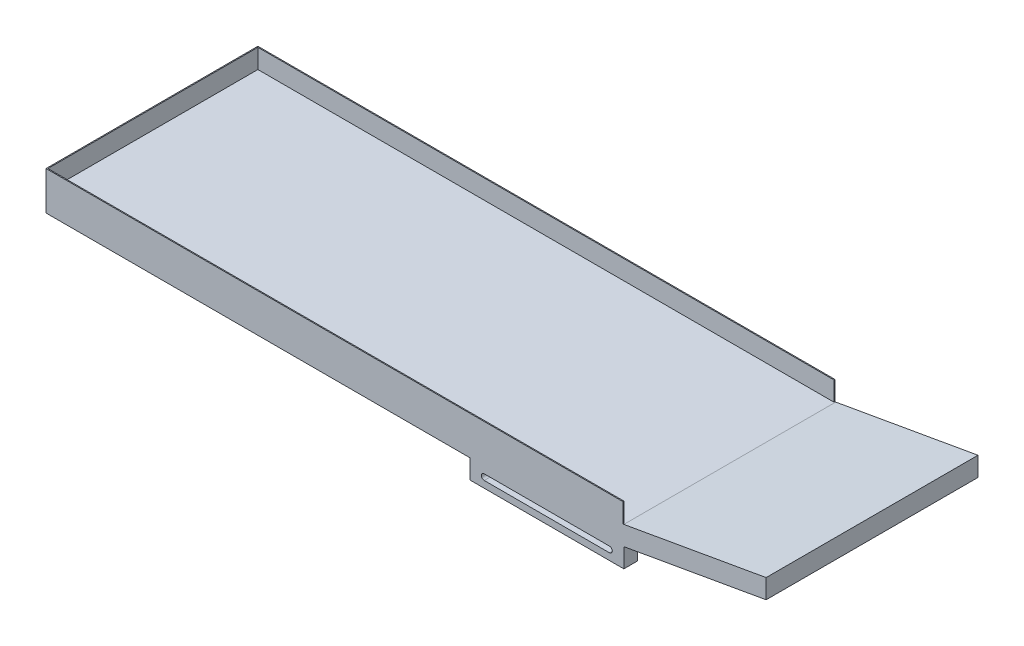
ISO-10303-21;
HEADER;
FILE_DESCRIPTION(('STEP AP214'),'2;1');
FILE_NAME('part.step','',(''),(''),'','','');
FILE_SCHEMA(('AUTOMOTIVE_DESIGN { 1 0 10303 214 1 1 1 1 }'));
ENDSEC;
DATA;
#1=APPLICATION_CONTEXT('core data for automotive mechanical design processes');
#2=APPLICATION_PROTOCOL_DEFINITION('international standard','automotive_design',2000,#1);
#3=PRODUCT_CONTEXT('',#1,'mechanical');
#4=PRODUCT('Part','Part','',(#3));
#5=PRODUCT_RELATED_PRODUCT_CATEGORY('part','',(#4));
#6=PRODUCT_DEFINITION_FORMATION('','',#4);
#7=PRODUCT_DEFINITION_CONTEXT('part definition',#1,'design');
#8=PRODUCT_DEFINITION('design','',#6,#7);
#9=PRODUCT_DEFINITION_SHAPE('','',#8);
#10=(LENGTH_UNIT() NAMED_UNIT(*) SI_UNIT(.MILLI.,.METRE.));
#11=(NAMED_UNIT(*) PLANE_ANGLE_UNIT() SI_UNIT($,.RADIAN.));
#12=(NAMED_UNIT(*) SI_UNIT($,.STERADIAN.) SOLID_ANGLE_UNIT());
#13=UNCERTAINTY_MEASURE_WITH_UNIT(LENGTH_MEASURE(1.E-05),#10,'distance_accuracy_value','');
#14=(GEOMETRIC_REPRESENTATION_CONTEXT(3) GLOBAL_UNCERTAINTY_ASSIGNED_CONTEXT((#13)) GLOBAL_UNIT_ASSIGNED_CONTEXT((#10,
#11,#12)) REPRESENTATION_CONTEXT('',''));
#15=CARTESIAN_POINT('',(0.,0.,0.));
#16=DIRECTION('',(0.,0.,1.));
#17=DIRECTION('',(1.,0.,0.));
#18=AXIS2_PLACEMENT_3D('',#15,#16,#17);
#19=CARTESIAN_POINT('',(0.,0.,220.));
#20=DIRECTION('',(0.,1.,0.));
#21=DIRECTION('',(0.,0.,1.));
#22=AXIS2_PLACEMENT_3D('',#19,#20,#21);
#23=PLANE('',#22);
#24=DIRECTION('',(-1.,0.,0.));
#25=VECTOR('',#24,1.);
#26=CARTESIAN_POINT('',(600.,0.,14.));
#27=LINE('',#26,#25);
#28=CARTESIAN_POINT('',(600.,0.,14.));
#29=VERTEX_POINT('',#28);
#30=CARTESIAN_POINT('',(440.,0.,14.));
#31=VERTEX_POINT('',#30);
#32=EDGE_CURVE('E322',#29,#31,#27,.T.);
#33=ORIENTED_EDGE('',*,*,#32,.F.);
#34=DIRECTION('',(0.,0.,-1.));
#35=VECTOR('',#34,1.);
#36=CARTESIAN_POINT('',(600.,0.,220.));
#37=LINE('',#36,#35);
#38=CARTESIAN_POINT('',(600.,0.,206.));
#39=VERTEX_POINT('',#38);
#40=EDGE_CURVE('E501',#39,#29,#37,.T.);
#41=ORIENTED_EDGE('',*,*,#40,.F.);
#42=DIRECTION('',(1.,0.,0.));
#43=VECTOR('',#42,1.);
#44=CARTESIAN_POINT('',(600.,0.,206.));
#45=LINE('',#44,#43);
#46=CARTESIAN_POINT('',(440.,0.,206.));
#47=VERTEX_POINT('',#46);
#48=EDGE_CURVE('E348',#47,#39,#45,.T.);
#49=ORIENTED_EDGE('',*,*,#48,.F.);
#50=DIRECTION('',(0.,0.,-1.));
#51=VECTOR('',#50,1.);
#52=CARTESIAN_POINT('',(440.,0.,220.));
#53=LINE('',#52,#51);
#54=CARTESIAN_POINT('',(440.,0.,220.));
#55=VERTEX_POINT('',#54);
#56=EDGE_CURVE('E331',#55,#47,#53,.T.);
#57=ORIENTED_EDGE('',*,*,#56,.F.);
#58=DIRECTION('',(1.,0.,0.));
#59=VECTOR('',#58,1.);
#60=CARTESIAN_POINT('',(0.,0.,220.));
#61=LINE('',#60,#59);
#62=CARTESIAN_POINT('',(0.,0.,220.));
#63=VERTEX_POINT('',#62);
#64=EDGE_CURVE('E454',#63,#55,#61,.T.);
#65=ORIENTED_EDGE('',*,*,#64,.F.);
#66=DIRECTION('',(0.,0.,-1.));
#67=VECTOR('',#66,1.);
#68=CARTESIAN_POINT('',(0.,0.,220.));
#69=LINE('',#68,#67);
#70=CARTESIAN_POINT('',(0.,0.,0.));
#71=VERTEX_POINT('',#70);
#72=EDGE_CURVE('E506',#63,#71,#69,.T.);
#73=ORIENTED_EDGE('',*,*,#72,.T.);
#74=DIRECTION('',(1.,0.,0.));
#75=VECTOR('',#74,1.);
#76=CARTESIAN_POINT('',(0.,0.,0.));
#77=LINE('',#76,#75);
#78=CARTESIAN_POINT('',(440.,0.,0.));
#79=VERTEX_POINT('',#78);
#80=EDGE_CURVE('E476',#71,#79,#77,.T.);
#81=ORIENTED_EDGE('',*,*,#80,.T.);
#82=DIRECTION('',(0.,0.,-1.));
#83=VECTOR('',#82,1.);
#84=CARTESIAN_POINT('',(440.,0.,0.));
#85=LINE('',#84,#83);
#86=EDGE_CURVE('E318',#31,#79,#85,.T.);
#87=ORIENTED_EDGE('',*,*,#86,.F.);
#88=EDGE_LOOP('',(#33,#41,#49,#57,#65,#73,#81,#87));
#89=FACE_BOUND('',#88,.T.);
#90=ADVANCED_FACE('F47',(#89),#23,.F.);
#91=CARTESIAN_POINT('',(0.,0.,220.));
#92=DIRECTION('',(1.,0.,0.));
#93=DIRECTION('',(0.,0.,-1.));
#94=AXIS2_PLACEMENT_3D('',#91,#92,#93);
#95=PLANE('',#94);
#96=DIRECTION('',(0.,-1.,0.));
#97=VECTOR('',#96,1.);
#98=CARTESIAN_POINT('',(0.,0.,0.));
#99=LINE('',#98,#97);
#100=CARTESIAN_POINT('',(0.,40.,0.));
#101=VERTEX_POINT('',#100);
#102=EDGE_CURVE('E449',#101,#71,#99,.T.);
#103=ORIENTED_EDGE('',*,*,#102,.T.);
#104=ORIENTED_EDGE('',*,*,#72,.F.);
#105=DIRECTION('',(0.,-1.,0.));
#106=VECTOR('',#105,1.);
#107=CARTESIAN_POINT('',(0.,0.,220.));
#108=LINE('',#107,#106);
#109=CARTESIAN_POINT('',(0.,40.,220.));
#110=VERTEX_POINT('',#109);
#111=EDGE_CURVE('E450',#110,#63,#108,.T.);
#112=ORIENTED_EDGE('',*,*,#111,.F.);
#113=DIRECTION('',(0.,0.,1.));
#114=VECTOR('',#113,1.);
#115=CARTESIAN_POINT('',(0.,40.,0.));
#116=LINE('',#115,#114);
#117=EDGE_CURVE('E404',#101,#110,#116,.T.);
#118=ORIENTED_EDGE('',*,*,#117,.F.);
#119=EDGE_LOOP('',(#103,#104,#112,#118));
#120=FACE_BOUND('',#119,.T.);
#121=ADVANCED_FACE('F49',(#120),#95,.F.);
#122=CARTESIAN_POINT('',(600.,0.,220.));
#123=DIRECTION('',(-0.173648177666931,0.984807753012208,0.));
#124=DIRECTION('',(-0.984807753012208,-0.173648177666931,0.));
#125=AXIS2_PLACEMENT_3D('',#122,#123,#124);
#126=PLANE('',#125);
#127=DIRECTION('',(0.984807753012208,0.173648177666931,0.));
#128=VECTOR('',#127,1.);
#129=CARTESIAN_POINT('',(600.,0.,0.));
#130=LINE('',#129,#128);
#131=CARTESIAN_POINT('',(600.,0.,0.));
#132=VERTEX_POINT('',#131);
#133=CARTESIAN_POINT('',(747.721162951831,26.0472266500397,0.));
#134=VERTEX_POINT('',#133);
#135=EDGE_CURVE('E479',#132,#134,#130,.T.);
#136=ORIENTED_EDGE('',*,*,#135,.T.);
#137=DIRECTION('',(0.,0.,-1.));
#138=VECTOR('',#137,1.);
#139=CARTESIAN_POINT('',(747.721162951831,26.0472266500397,220.));
#140=LINE('',#139,#138);
#141=CARTESIAN_POINT('',(747.721162951831,26.0472266500397,220.));
#142=VERTEX_POINT('',#141);
#143=EDGE_CURVE('E497',#142,#134,#140,.T.);
#144=ORIENTED_EDGE('',*,*,#143,.F.);
#145=DIRECTION('',(0.984807753012208,0.173648177666931,0.));
#146=VECTOR('',#145,1.);
#147=CARTESIAN_POINT('',(600.,0.,220.));
#148=LINE('',#147,#146);
#149=CARTESIAN_POINT('',(600.,0.,220.));
#150=VERTEX_POINT('',#149);
#151=EDGE_CURVE('E459',#150,#142,#148,.T.);
#152=ORIENTED_EDGE('',*,*,#151,.F.);
#153=EDGE_CURVE('E502',#150,#39,#37,.T.);
#154=ORIENTED_EDGE('',*,*,#153,.T.);
#155=ORIENTED_EDGE('',*,*,#40,.T.);
#156=DIRECTION('',(0.,0.,1.));
#157=VECTOR('',#156,1.);
#158=CARTESIAN_POINT('',(600.,0.,0.));
#159=LINE('',#158,#157);
#160=EDGE_CURVE('E327',#132,#29,#159,.T.);
#161=ORIENTED_EDGE('',*,*,#160,.F.);
#162=EDGE_LOOP('',(#136,#144,#152,#154,#155,#161));
#163=FACE_BOUND('',#162,.T.);
#164=ADVANCED_FACE('F545',(#163),#126,.F.);
#165=CARTESIAN_POINT('',(747.721162951831,46.0472266500397,220.));
#166=DIRECTION('',(-1.,0.,0.));
#167=DIRECTION('',(0.,0.,1.));
#168=AXIS2_PLACEMENT_3D('',#165,#166,#167);
#169=PLANE('',#168);
#170=DIRECTION('',(0.,1.,0.));
#171=VECTOR('',#170,1.);
#172=CARTESIAN_POINT('',(747.721162951831,46.0472266500397,0.));
#173=LINE('',#172,#171);
#174=CARTESIAN_POINT('',(747.721162951831,46.0472266500397,0.));
#175=VERTEX_POINT('',#174);
#176=EDGE_CURVE('E482',#134,#175,#173,.T.);
#177=ORIENTED_EDGE('',*,*,#176,.T.);
#178=DIRECTION('',(0.,0.,-1.));
#179=VECTOR('',#178,1.);
#180=CARTESIAN_POINT('',(747.721162951831,46.0472266500397,220.));
#181=LINE('',#180,#179);
#182=CARTESIAN_POINT('',(747.721162951831,46.0472266500397,220.));
#183=VERTEX_POINT('',#182);
#184=EDGE_CURVE('E493',#183,#175,#181,.T.);
#185=ORIENTED_EDGE('',*,*,#184,.F.);
#186=DIRECTION('',(0.,1.,0.));
#187=VECTOR('',#186,1.);
#188=CARTESIAN_POINT('',(747.721162951831,46.0472266500397,220.));
#189=LINE('',#188,#187);
#190=EDGE_CURVE('E462',#142,#183,#189,.T.);
#191=ORIENTED_EDGE('',*,*,#190,.F.);
#192=ORIENTED_EDGE('',*,*,#143,.T.);
#193=EDGE_LOOP('',(#177,#185,#191,#192));
#194=FACE_BOUND('',#193,.T.);
#195=ADVANCED_FACE('F549',(#194),#169,.F.);
#196=CARTESIAN_POINT('',(600.,20.,220.));
#197=DIRECTION('',(0.173648177666931,-0.984807753012208,0.));
#198=DIRECTION('',(0.984807753012208,0.173648177666931,0.));
#199=AXIS2_PLACEMENT_3D('',#196,#197,#198);
#200=PLANE('',#199);
#201=DIRECTION('',(-0.984807753012208,-0.173648177666931,0.));
#202=VECTOR('',#201,1.);
#203=CARTESIAN_POINT('',(600.,20.,0.));
#204=LINE('',#203,#202);
#205=CARTESIAN_POINT('',(600.,20.,0.));
#206=VERTEX_POINT('',#205);
#207=EDGE_CURVE('E485',#175,#206,#204,.T.);
#208=ORIENTED_EDGE('',*,*,#207,.T.);
#209=DIRECTION('',(0.,0.,-1.));
#210=VECTOR('',#209,1.);
#211=CARTESIAN_POINT('',(600.,20.,220.));
#212=LINE('',#211,#210);
#213=CARTESIAN_POINT('',(600.,20.,220.));
#214=VERTEX_POINT('',#213);
#215=EDGE_CURVE('E472',#214,#206,#212,.T.);
#216=ORIENTED_EDGE('',*,*,#215,.F.);
#217=DIRECTION('',(-0.984807753012208,-0.173648177666931,0.));
#218=VECTOR('',#217,1.);
#219=CARTESIAN_POINT('',(600.,20.,220.));
#220=LINE('',#219,#218);
#221=EDGE_CURVE('E465',#183,#214,#220,.T.);
#222=ORIENTED_EDGE('',*,*,#221,.F.);
#223=ORIENTED_EDGE('',*,*,#184,.T.);
#224=EDGE_LOOP('',(#208,#216,#222,#223));
#225=FACE_BOUND('',#224,.T.);
#226=ADVANCED_FACE('F553',(#225),#200,.F.);
#227=CARTESIAN_POINT('',(0.,20.,220.));
#228=DIRECTION('',(0.,-1.,0.));
#229=DIRECTION('',(1.,0.,0.));
#230=AXIS2_PLACEMENT_3D('',#227,#228,#229);
#231=PLANE('',#230);
#232=DIRECTION('',(1.,0.,0.));
#233=VECTOR('',#232,1.);
#234=CARTESIAN_POINT('',(0.,20.,219.));
#235=LINE('',#234,#233);
#236=CARTESIAN_POINT('',(1.00000000000003,20.,219.));
#237=VERTEX_POINT('',#236);
#238=CARTESIAN_POINT('',(599.,20.,219.));
#239=VERTEX_POINT('',#238);
#240=EDGE_CURVE('E414',#237,#239,#235,.T.);
#241=ORIENTED_EDGE('',*,*,#240,.T.);
#242=DIRECTION('',(0.,0.,1.));
#243=VECTOR('',#242,1.);
#244=CARTESIAN_POINT('',(599.,20.,0.));
#245=LINE('',#244,#243);
#246=CARTESIAN_POINT('',(599.,20.,220.));
#247=VERTEX_POINT('',#246);
#248=EDGE_CURVE('E379',#239,#247,#245,.T.);
#249=ORIENTED_EDGE('',*,*,#248,.T.);
#250=DIRECTION('',(-1.,0.,0.));
#251=VECTOR('',#250,1.);
#252=CARTESIAN_POINT('',(0.,20.,220.));
#253=LINE('',#252,#251);
#254=EDGE_CURVE('E468',#214,#247,#253,.T.);
#255=ORIENTED_EDGE('',*,*,#254,.F.);
#256=ORIENTED_EDGE('',*,*,#215,.T.);
#257=DIRECTION('',(-1.,0.,0.));
#258=VECTOR('',#257,1.);
#259=CARTESIAN_POINT('',(0.,20.,0.));
#260=LINE('',#259,#258);
#261=CARTESIAN_POINT('',(599.,20.,0.));
#262=VERTEX_POINT('',#261);
#263=EDGE_CURVE('E455',#206,#262,#260,.T.);
#264=ORIENTED_EDGE('',*,*,#263,.T.);
#265=DIRECTION('',(0.,0.,-1.));
#266=VECTOR('',#265,1.);
#267=CARTESIAN_POINT('',(599.,20.,0.));
#268=LINE('',#267,#266);
#269=CARTESIAN_POINT('',(599.,20.,1.));
#270=VERTEX_POINT('',#269);
#271=EDGE_CURVE('E385',#270,#262,#268,.T.);
#272=ORIENTED_EDGE('',*,*,#271,.F.);
#273=DIRECTION('',(-1.,0.,0.));
#274=VECTOR('',#273,1.);
#275=CARTESIAN_POINT('',(0.,20.,1.));
#276=LINE('',#275,#274);
#277=CARTESIAN_POINT('',(1.,20.,1.));
#278=VERTEX_POINT('',#277);
#279=EDGE_CURVE('E420',#270,#278,#276,.T.);
#280=ORIENTED_EDGE('',*,*,#279,.T.);
#281=DIRECTION('',(0.,0.,1.));
#282=VECTOR('',#281,1.);
#283=CARTESIAN_POINT('',(1.,20.,0.));
#284=LINE('',#283,#282);
#285=EDGE_CURVE('E417',#278,#237,#284,.T.);
#286=ORIENTED_EDGE('',*,*,#285,.T.);
#287=EDGE_LOOP('',(#241,#249,#255,#256,#264,#272,#280,#286));
#288=FACE_BOUND('',#287,.T.);
#289=ADVANCED_FACE('F557',(#288),#231,.F.);
#290=CARTESIAN_POINT('',(0.,0.,220.));
#291=DIRECTION('',(0.,0.,-1.));
#292=DIRECTION('',(-1.,0.,0.));
#293=AXIS2_PLACEMENT_3D('',#290,#291,#292);
#294=PLANE('',#293);
#295=DIRECTION('',(-1.,0.,0.));
#296=VECTOR('',#295,1.);
#297=CARTESIAN_POINT('',(585.,-7.,220.));
#298=LINE('',#297,#296);
#299=CARTESIAN_POINT('',(585.,-7.,220.));
#300=VERTEX_POINT('',#299);
#301=CARTESIAN_POINT('',(455.,-7.00000000000001,220.));
#302=VERTEX_POINT('',#301);
#303=EDGE_CURVE('E267',#300,#302,#298,.T.);
#304=ORIENTED_EDGE('',*,*,#303,.F.);
#305=CARTESIAN_POINT('',(585.,-10.,220.));
#306=DIRECTION('',(0.,0.,1.));
#307=DIRECTION('',(1.,0.,0.));
#308=AXIS2_PLACEMENT_3D('',#305,#306,#307);
#309=CIRCLE('',#308,3.);
#310=CARTESIAN_POINT('',(585.,-13.,220.));
#311=VERTEX_POINT('',#310);
#312=EDGE_CURVE('E63',#311,#300,#309,.T.);
#313=ORIENTED_EDGE('',*,*,#312,.F.);
#314=DIRECTION('',(1.,0.,0.));
#315=VECTOR('',#314,1.);
#316=CARTESIAN_POINT('',(585.,-13.,220.));
#317=LINE('',#316,#315);
#318=CARTESIAN_POINT('',(455.,-13.,220.));
#319=VERTEX_POINT('',#318);
#320=EDGE_CURVE('E254',#319,#311,#317,.T.);
#321=ORIENTED_EDGE('',*,*,#320,.F.);
#322=CARTESIAN_POINT('',(455.,-10.,220.));
#323=DIRECTION('',(0.,0.,1.));
#324=DIRECTION('',(1.,0.,0.));
#325=AXIS2_PLACEMENT_3D('',#322,#323,#324);
#326=CIRCLE('',#325,3.);
#327=EDGE_CURVE('E258',#302,#319,#326,.T.);
#328=ORIENTED_EDGE('',*,*,#327,.F.);
#329=EDGE_LOOP('',(#304,#313,#321,#328));
#330=FACE_BOUND('',#329,.T.);
#331=ORIENTED_EDGE('',*,*,#111,.T.);
#332=ORIENTED_EDGE('',*,*,#64,.T.);
#333=DIRECTION('',(0.,1.,0.));
#334=VECTOR('',#333,1.);
#335=CARTESIAN_POINT('',(440.,-20.,220.));
#336=LINE('',#335,#334);
#337=CARTESIAN_POINT('',(440.,-20.,220.));
#338=VERTEX_POINT('',#337);
#339=EDGE_CURVE('E371',#338,#55,#336,.T.);
#340=ORIENTED_EDGE('',*,*,#339,.F.);
#341=DIRECTION('',(-1.,0.,0.));
#342=VECTOR('',#341,1.);
#343=CARTESIAN_POINT('',(600.,-20.,220.));
#344=LINE('',#343,#342);
#345=CARTESIAN_POINT('',(600.,-20.,220.));
#346=VERTEX_POINT('',#345);
#347=EDGE_CURVE('E347',#346,#338,#344,.T.);
#348=ORIENTED_EDGE('',*,*,#347,.F.);
#349=DIRECTION('',(0.,1.,0.));
#350=VECTOR('',#349,1.);
#351=CARTESIAN_POINT('',(600.,-20.,220.));
#352=LINE('',#351,#350);
#353=EDGE_CURVE('E375',#346,#150,#352,.T.);
#354=ORIENTED_EDGE('',*,*,#353,.T.);
#355=ORIENTED_EDGE('',*,*,#151,.T.);
#356=ORIENTED_EDGE('',*,*,#190,.T.);
#357=ORIENTED_EDGE('',*,*,#221,.T.);
#358=ORIENTED_EDGE('',*,*,#254,.T.);
#359=DIRECTION('',(0.,-1.,0.));
#360=VECTOR('',#359,1.);
#361=CARTESIAN_POINT('',(599.,40.,220.));
#362=LINE('',#361,#360);
#363=CARTESIAN_POINT('',(599.,40.,220.));
#364=VERTEX_POINT('',#363);
#365=EDGE_CURVE('E411',#364,#247,#362,.T.);
#366=ORIENTED_EDGE('',*,*,#365,.F.);
#367=DIRECTION('',(1.,0.,0.));
#368=VECTOR('',#367,1.);
#369=CARTESIAN_POINT('',(0.,40.,220.));
#370=LINE('',#369,#368);
#371=EDGE_CURVE('E408',#110,#364,#370,.T.);
#372=ORIENTED_EDGE('',*,*,#371,.F.);
#373=EDGE_LOOP('',(#331,#332,#340,#348,#354,#355,#356,#357,#358,#366,#372));
#374=FACE_BOUND('',#373,.T.);
#375=ADVANCED_FACE('F561',(#330,#374),#294,.F.);
#376=CARTESIAN_POINT('',(0.,0.,0.));
#377=DIRECTION('',(0.,0.,-1.));
#378=DIRECTION('',(-1.,0.,0.));
#379=AXIS2_PLACEMENT_3D('',#376,#377,#378);
#380=PLANE('',#379);
#381=CARTESIAN_POINT('',(585.,-10.,0.));
#382=DIRECTION('',(0.,0.,1.));
#383=DIRECTION('',(1.,0.,0.));
#384=AXIS2_PLACEMENT_3D('',#381,#382,#383);
#385=CIRCLE('',#384,3.);
#386=CARTESIAN_POINT('',(585.,-13.,0.));
#387=VERTEX_POINT('',#386);
#388=CARTESIAN_POINT('',(585.,-7.,0.));
#389=VERTEX_POINT('',#388);
#390=EDGE_CURVE('E234',#387,#389,#385,.T.);
#391=ORIENTED_EDGE('',*,*,#390,.T.);
#392=DIRECTION('',(-1.,0.,0.));
#393=VECTOR('',#392,1.);
#394=CARTESIAN_POINT('',(585.,-7.,0.));
#395=LINE('',#394,#393);
#396=CARTESIAN_POINT('',(455.,-7.00000000000001,0.));
#397=VERTEX_POINT('',#396);
#398=EDGE_CURVE('E243',#389,#397,#395,.T.);
#399=ORIENTED_EDGE('',*,*,#398,.T.);
#400=CARTESIAN_POINT('',(455.,-10.,0.));
#401=DIRECTION('',(0.,0.,1.));
#402=DIRECTION('',(1.,0.,0.));
#403=AXIS2_PLACEMENT_3D('',#400,#401,#402);
#404=CIRCLE('',#403,3.);
#405=CARTESIAN_POINT('',(455.,-13.,0.));
#406=VERTEX_POINT('',#405);
#407=EDGE_CURVE('E71',#397,#406,#404,.T.);
#408=ORIENTED_EDGE('',*,*,#407,.T.);
#409=DIRECTION('',(1.,0.,0.));
#410=VECTOR('',#409,1.);
#411=CARTESIAN_POINT('',(585.,-13.,0.));
#412=LINE('',#411,#410);
#413=EDGE_CURVE('E252',#406,#387,#412,.T.);
#414=ORIENTED_EDGE('',*,*,#413,.T.);
#415=EDGE_LOOP('',(#391,#399,#408,#414));
#416=FACE_BOUND('',#415,.T.);
#417=ORIENTED_EDGE('',*,*,#102,.F.);
#418=DIRECTION('',(-1.,0.,0.));
#419=VECTOR('',#418,1.);
#420=CARTESIAN_POINT('',(0.,40.,0.));
#421=LINE('',#420,#419);
#422=CARTESIAN_POINT('',(599.,40.,0.));
#423=VERTEX_POINT('',#422);
#424=EDGE_CURVE('E400',#423,#101,#421,.T.);
#425=ORIENTED_EDGE('',*,*,#424,.F.);
#426=DIRECTION('',(0.,-1.,0.));
#427=VECTOR('',#426,1.);
#428=CARTESIAN_POINT('',(599.,40.,0.));
#429=LINE('',#428,#427);
#430=EDGE_CURVE('E429',#423,#262,#429,.T.);
#431=ORIENTED_EDGE('',*,*,#430,.T.);
#432=ORIENTED_EDGE('',*,*,#263,.F.);
#433=ORIENTED_EDGE('',*,*,#207,.F.);
#434=ORIENTED_EDGE('',*,*,#176,.F.);
#435=ORIENTED_EDGE('',*,*,#135,.F.);
#436=DIRECTION('',(0.,1.,0.));
#437=VECTOR('',#436,1.);
#438=CARTESIAN_POINT('',(600.,-20.,0.));
#439=LINE('',#438,#437);
#440=CARTESIAN_POINT('',(600.,-20.,0.));
#441=VERTEX_POINT('',#440);
#442=EDGE_CURVE('E313',#441,#132,#439,.T.);
#443=ORIENTED_EDGE('',*,*,#442,.F.);
#444=DIRECTION('',(1.,0.,0.));
#445=VECTOR('',#444,1.);
#446=CARTESIAN_POINT('',(600.,-20.,0.));
#447=LINE('',#446,#445);
#448=CARTESIAN_POINT('',(440.,-20.,0.));
#449=VERTEX_POINT('',#448);
#450=EDGE_CURVE('E317',#449,#441,#447,.T.);
#451=ORIENTED_EDGE('',*,*,#450,.F.);
#452=DIRECTION('',(0.,1.,0.));
#453=VECTOR('',#452,1.);
#454=CARTESIAN_POINT('',(440.,-20.,0.));
#455=LINE('',#454,#453);
#456=EDGE_CURVE('E309',#449,#79,#455,.T.);
#457=ORIENTED_EDGE('',*,*,#456,.T.);
#458=ORIENTED_EDGE('',*,*,#80,.F.);
#459=EDGE_LOOP('',(#417,#425,#431,#432,#433,#434,#435,#443,#451,#457,#458));
#460=FACE_BOUND('',#459,.T.);
#461=ADVANCED_FACE('F249',(#416,#460),#380,.T.);
#462=CARTESIAN_POINT('',(599.,40.,0.));
#463=DIRECTION('',(1.,0.,0.));
#464=DIRECTION('',(0.,1.,0.));
#465=AXIS2_PLACEMENT_3D('',#462,#463,#464);
#466=PLANE('',#465);
#467=ORIENTED_EDGE('',*,*,#248,.F.);
#468=DIRECTION('',(0.,-1.,0.));
#469=VECTOR('',#468,1.);
#470=CARTESIAN_POINT('',(599.,40.,219.));
#471=LINE('',#470,#469);
#472=CARTESIAN_POINT('',(599.,40.,219.));
#473=VERTEX_POINT('',#472);
#474=EDGE_CURVE('E445',#473,#239,#471,.T.);
#475=ORIENTED_EDGE('',*,*,#474,.F.);
#476=DIRECTION('',(0.,0.,1.));
#477=VECTOR('',#476,1.);
#478=CARTESIAN_POINT('',(599.,40.,0.));
#479=LINE('',#478,#477);
#480=EDGE_CURVE('E380',#473,#364,#479,.T.);
#481=ORIENTED_EDGE('',*,*,#480,.T.);
#482=ORIENTED_EDGE('',*,*,#365,.T.);
#483=EDGE_LOOP('',(#467,#475,#481,#482));
#484=FACE_BOUND('',#483,.T.);
#485=ADVANCED_FACE('F565',(#484),#466,.T.);
#486=CARTESIAN_POINT('',(0.,40.,219.));
#487=DIRECTION('',(0.,0.,-1.));
#488=DIRECTION('',(-1.,0.,0.));
#489=AXIS2_PLACEMENT_3D('',#486,#487,#488);
#490=PLANE('',#489);
#491=ORIENTED_EDGE('',*,*,#240,.F.);
#492=DIRECTION('',(0.,-1.,0.));
#493=VECTOR('',#492,1.);
#494=CARTESIAN_POINT('',(1.00000000000003,40.,219.));
#495=LINE('',#494,#493);
#496=CARTESIAN_POINT('',(1.00000000000003,40.,219.));
#497=VERTEX_POINT('',#496);
#498=EDGE_CURVE('E441',#497,#237,#495,.T.);
#499=ORIENTED_EDGE('',*,*,#498,.F.);
#500=DIRECTION('',(1.,0.,0.));
#501=VECTOR('',#500,1.);
#502=CARTESIAN_POINT('',(0.,40.,219.));
#503=LINE('',#502,#501);
#504=EDGE_CURVE('E384',#497,#473,#503,.T.);
#505=ORIENTED_EDGE('',*,*,#504,.T.);
#506=ORIENTED_EDGE('',*,*,#474,.T.);
#507=EDGE_LOOP('',(#491,#499,#505,#506));
#508=FACE_BOUND('',#507,.T.);
#509=ADVANCED_FACE('F571',(#508),#490,.T.);
#510=CARTESIAN_POINT('',(1.,40.,0.));
#511=DIRECTION('',(1.,0.,0.));
#512=DIRECTION('',(0.,0.,-1.));
#513=AXIS2_PLACEMENT_3D('',#510,#511,#512);
#514=PLANE('',#513);
#515=ORIENTED_EDGE('',*,*,#285,.F.);
#516=DIRECTION('',(0.,-1.,0.));
#517=VECTOR('',#516,1.);
#518=CARTESIAN_POINT('',(1.,40.,1.));
#519=LINE('',#518,#517);
#520=CARTESIAN_POINT('',(1.,40.,1.));
#521=VERTEX_POINT('',#520);
#522=EDGE_CURVE('E437',#521,#278,#519,.T.);
#523=ORIENTED_EDGE('',*,*,#522,.F.);
#524=DIRECTION('',(0.,0.,1.));
#525=VECTOR('',#524,1.);
#526=CARTESIAN_POINT('',(1.,40.,0.));
#527=LINE('',#526,#525);
#528=EDGE_CURVE('E389',#521,#497,#527,.T.);
#529=ORIENTED_EDGE('',*,*,#528,.T.);
#530=ORIENTED_EDGE('',*,*,#498,.T.);
#531=EDGE_LOOP('',(#515,#523,#529,#530));
#532=FACE_BOUND('',#531,.T.);
#533=ADVANCED_FACE('F575',(#532),#514,.T.);
#534=CARTESIAN_POINT('',(0.,40.,1.));
#535=DIRECTION('',(0.,0.,1.));
#536=DIRECTION('',(1.,0.,0.));
#537=AXIS2_PLACEMENT_3D('',#534,#535,#536);
#538=PLANE('',#537);
#539=ORIENTED_EDGE('',*,*,#279,.F.);
#540=DIRECTION('',(0.,-1.,0.));
#541=VECTOR('',#540,1.);
#542=CARTESIAN_POINT('',(599.,40.,1.));
#543=LINE('',#542,#541);
#544=CARTESIAN_POINT('',(599.,40.,1.));
#545=VERTEX_POINT('',#544);
#546=EDGE_CURVE('E433',#545,#270,#543,.T.);
#547=ORIENTED_EDGE('',*,*,#546,.F.);
#548=DIRECTION('',(-1.,0.,0.));
#549=VECTOR('',#548,1.);
#550=CARTESIAN_POINT('',(0.,40.,1.));
#551=LINE('',#550,#549);
#552=EDGE_CURVE('E393',#545,#521,#551,.T.);
#553=ORIENTED_EDGE('',*,*,#552,.T.);
#554=ORIENTED_EDGE('',*,*,#522,.T.);
#555=EDGE_LOOP('',(#539,#547,#553,#554));
#556=FACE_BOUND('',#555,.T.);
#557=ADVANCED_FACE('F579',(#556),#538,.T.);
#558=CARTESIAN_POINT('',(599.,40.,0.));
#559=DIRECTION('',(-1.,0.,0.));
#560=DIRECTION('',(0.,-1.,0.));
#561=AXIS2_PLACEMENT_3D('',#558,#559,#560);
#562=PLANE('',#561);
#563=ORIENTED_EDGE('',*,*,#271,.T.);
#564=ORIENTED_EDGE('',*,*,#430,.F.);
#565=DIRECTION('',(0.,0.,-1.));
#566=VECTOR('',#565,1.);
#567=CARTESIAN_POINT('',(599.,40.,0.));
#568=LINE('',#567,#566);
#569=EDGE_CURVE('E397',#545,#423,#568,.T.);
#570=ORIENTED_EDGE('',*,*,#569,.F.);
#571=ORIENTED_EDGE('',*,*,#546,.T.);
#572=EDGE_LOOP('',(#563,#564,#570,#571));
#573=FACE_BOUND('',#572,.T.);
#574=ADVANCED_FACE('F583',(#573),#562,.F.);
#575=CARTESIAN_POINT('',(0.,40.,0.));
#576=DIRECTION('',(0.,1.,0.));
#577=DIRECTION('',(-1.,0.,0.));
#578=AXIS2_PLACEMENT_3D('',#575,#576,#577);
#579=PLANE('',#578);
#580=ORIENTED_EDGE('',*,*,#480,.F.);
#581=ORIENTED_EDGE('',*,*,#504,.F.);
#582=ORIENTED_EDGE('',*,*,#528,.F.);
#583=ORIENTED_EDGE('',*,*,#552,.F.);
#584=ORIENTED_EDGE('',*,*,#569,.T.);
#585=ORIENTED_EDGE('',*,*,#424,.T.);
#586=ORIENTED_EDGE('',*,*,#117,.T.);
#587=ORIENTED_EDGE('',*,*,#371,.T.);
#588=EDGE_LOOP('',(#580,#581,#582,#583,#584,#585,#586,#587));
#589=FACE_BOUND('',#588,.T.);
#590=ADVANCED_FACE('F587',(#589),#579,.T.);
#591=CARTESIAN_POINT('',(600.,-20.,220.));
#592=DIRECTION('',(-1.,0.,0.));
#593=DIRECTION('',(0.,0.,1.));
#594=AXIS2_PLACEMENT_3D('',#591,#592,#593);
#595=PLANE('',#594);
#596=ORIENTED_EDGE('',*,*,#153,.F.);
#597=ORIENTED_EDGE('',*,*,#353,.F.);
#598=DIRECTION('',(0.,0.,1.));
#599=VECTOR('',#598,1.);
#600=CARTESIAN_POINT('',(600.,-20.,220.));
#601=LINE('',#600,#599);
#602=CARTESIAN_POINT('',(600.,-20.,206.));
#603=VERTEX_POINT('',#602);
#604=EDGE_CURVE('E343',#603,#346,#601,.T.);
#605=ORIENTED_EDGE('',*,*,#604,.F.);
#606=DIRECTION('',(0.,1.,0.));
#607=VECTOR('',#606,1.);
#608=CARTESIAN_POINT('',(600.,-20.,206.));
#609=LINE('',#608,#607);
#610=EDGE_CURVE('E357',#603,#39,#609,.T.);
#611=ORIENTED_EDGE('',*,*,#610,.T.);
#612=EDGE_LOOP('',(#596,#597,#605,#611));
#613=FACE_BOUND('',#612,.T.);
#614=ADVANCED_FACE('F590',(#613),#595,.F.);
#615=CARTESIAN_POINT('',(440.,-20.,220.));
#616=DIRECTION('',(1.,0.,0.));
#617=DIRECTION('',(0.,0.,-1.));
#618=AXIS2_PLACEMENT_3D('',#615,#616,#617);
#619=PLANE('',#618);
#620=ORIENTED_EDGE('',*,*,#56,.T.);
#621=DIRECTION('',(0.,1.,0.));
#622=VECTOR('',#621,1.);
#623=CARTESIAN_POINT('',(440.,-20.,206.));
#624=LINE('',#623,#622);
#625=CARTESIAN_POINT('',(440.,-20.,206.));
#626=VERTEX_POINT('',#625);
#627=EDGE_CURVE('E367',#626,#47,#624,.T.);
#628=ORIENTED_EDGE('',*,*,#627,.F.);
#629=DIRECTION('',(0.,0.,-1.));
#630=VECTOR('',#629,1.);
#631=CARTESIAN_POINT('',(440.,-20.,220.));
#632=LINE('',#631,#630);
#633=EDGE_CURVE('E351',#338,#626,#632,.T.);
#634=ORIENTED_EDGE('',*,*,#633,.F.);
#635=ORIENTED_EDGE('',*,*,#339,.T.);
#636=EDGE_LOOP('',(#620,#628,#634,#635));
#637=FACE_BOUND('',#636,.T.);
#638=ADVANCED_FACE('F594',(#637),#619,.F.);
#639=CARTESIAN_POINT('',(600.,-20.,206.));
#640=DIRECTION('',(0.,0.,1.));
#641=DIRECTION('',(1.,0.,0.));
#642=AXIS2_PLACEMENT_3D('',#639,#640,#641);
#643=PLANE('',#642);
#644=DIRECTION('',(1.,0.,0.));
#645=VECTOR('',#644,1.);
#646=CARTESIAN_POINT('',(600.,-13.,206.));
#647=LINE('',#646,#645);
#648=CARTESIAN_POINT('',(455.,-13.,206.));
#649=VERTEX_POINT('',#648);
#650=CARTESIAN_POINT('',(585.,-13.,206.));
#651=VERTEX_POINT('',#650);
#652=EDGE_CURVE('E293',#649,#651,#647,.T.);
#653=ORIENTED_EDGE('',*,*,#652,.T.);
#654=CARTESIAN_POINT('',(585.,-10.,206.));
#655=DIRECTION('',(0.,0.,1.));
#656=DIRECTION('',(1.,0.,0.));
#657=AXIS2_PLACEMENT_3D('',#654,#655,#656);
#658=CIRCLE('',#657,3.);
#659=CARTESIAN_POINT('',(585.,-7.,206.));
#660=VERTEX_POINT('',#659);
#661=EDGE_CURVE('E297',#651,#660,#658,.T.);
#662=ORIENTED_EDGE('',*,*,#661,.T.);
#663=DIRECTION('',(-1.,0.,0.));
#664=VECTOR('',#663,1.);
#665=CARTESIAN_POINT('',(600.,-7.,206.));
#666=LINE('',#665,#664);
#667=CARTESIAN_POINT('',(455.,-7.00000000000001,206.));
#668=VERTEX_POINT('',#667);
#669=EDGE_CURVE('E277',#660,#668,#666,.T.);
#670=ORIENTED_EDGE('',*,*,#669,.T.);
#671=CARTESIAN_POINT('',(455.,-10.,206.));
#672=DIRECTION('',(0.,0.,1.));
#673=DIRECTION('',(1.,0.,0.));
#674=AXIS2_PLACEMENT_3D('',#671,#672,#673);
#675=CIRCLE('',#674,3.);
#676=EDGE_CURVE('E289',#668,#649,#675,.T.);
#677=ORIENTED_EDGE('',*,*,#676,.T.);
#678=EDGE_LOOP('',(#653,#662,#670,#677));
#679=FACE_BOUND('',#678,.T.);
#680=ORIENTED_EDGE('',*,*,#48,.T.);
#681=ORIENTED_EDGE('',*,*,#610,.F.);
#682=DIRECTION('',(1.,0.,0.));
#683=VECTOR('',#682,1.);
#684=CARTESIAN_POINT('',(600.,-20.,206.));
#685=LINE('',#684,#683);
#686=EDGE_CURVE('E354',#626,#603,#685,.T.);
#687=ORIENTED_EDGE('',*,*,#686,.F.);
#688=ORIENTED_EDGE('',*,*,#627,.T.);
#689=EDGE_LOOP('',(#680,#681,#687,#688));
#690=FACE_BOUND('',#689,.T.);
#691=ADVANCED_FACE('F598',(#679,#690),#643,.F.);
#692=CARTESIAN_POINT('',(0.,-20.,0.));
#693=DIRECTION('',(0.,1.,0.));
#694=DIRECTION('',(0.,0.,1.));
#695=AXIS2_PLACEMENT_3D('',#692,#693,#694);
#696=PLANE('',#695);
#697=ORIENTED_EDGE('',*,*,#604,.T.);
#698=ORIENTED_EDGE('',*,*,#347,.T.);
#699=ORIENTED_EDGE('',*,*,#633,.T.);
#700=ORIENTED_EDGE('',*,*,#686,.T.);
#701=EDGE_LOOP('',(#697,#698,#699,#700));
#702=FACE_BOUND('',#701,.T.);
#703=ADVANCED_FACE('F602',(#702),#696,.F.);
#704=CARTESIAN_POINT('',(600.,-20.,0.));
#705=DIRECTION('',(-1.,0.,0.));
#706=DIRECTION('',(0.,0.,1.));
#707=AXIS2_PLACEMENT_3D('',#704,#705,#706);
#708=PLANE('',#707);
#709=ORIENTED_EDGE('',*,*,#160,.T.);
#710=DIRECTION('',(0.,1.,0.));
#711=VECTOR('',#710,1.);
#712=CARTESIAN_POINT('',(600.,-20.,14.));
#713=LINE('',#712,#711);
#714=CARTESIAN_POINT('',(600.,-20.,14.));
#715=VERTEX_POINT('',#714);
#716=EDGE_CURVE('E301',#715,#29,#713,.T.);
#717=ORIENTED_EDGE('',*,*,#716,.F.);
#718=DIRECTION('',(0.,0.,1.));
#719=VECTOR('',#718,1.);
#720=CARTESIAN_POINT('',(600.,-20.,0.));
#721=LINE('',#720,#719);
#722=EDGE_CURVE('E323',#441,#715,#721,.T.);
#723=ORIENTED_EDGE('',*,*,#722,.F.);
#724=ORIENTED_EDGE('',*,*,#442,.T.);
#725=EDGE_LOOP('',(#709,#717,#723,#724));
#726=FACE_BOUND('',#725,.T.);
#727=ADVANCED_FACE('F606',(#726),#708,.F.);
#728=CARTESIAN_POINT('',(600.,-20.,14.));
#729=DIRECTION('',(0.,0.,-1.));
#730=DIRECTION('',(-1.,0.,0.));
#731=AXIS2_PLACEMENT_3D('',#728,#729,#730);
#732=PLANE('',#731);
#733=DIRECTION('',(1.,0.,0.));
#734=VECTOR('',#733,1.);
#735=CARTESIAN_POINT('',(600.,-7.,14.));
#736=LINE('',#735,#734);
#737=CARTESIAN_POINT('',(455.,-7.00000000000001,14.));
#738=VERTEX_POINT('',#737);
#739=CARTESIAN_POINT('',(585.,-7.,14.));
#740=VERTEX_POINT('',#739);
#741=EDGE_CURVE('E510',#738,#740,#736,.T.);
#742=ORIENTED_EDGE('',*,*,#741,.T.);
#743=CARTESIAN_POINT('',(585.,-10.,14.));
#744=DIRECTION('',(0.,0.,-1.));
#745=DIRECTION('',(-1.,0.,0.));
#746=AXIS2_PLACEMENT_3D('',#743,#744,#745);
#747=CIRCLE('',#746,3.);
#748=CARTESIAN_POINT('',(585.,-13.,14.));
#749=VERTEX_POINT('',#748);
#750=EDGE_CURVE('E11',#740,#749,#747,.T.);
#751=ORIENTED_EDGE('',*,*,#750,.T.);
#752=DIRECTION('',(-1.,0.,0.));
#753=VECTOR('',#752,1.);
#754=CARTESIAN_POINT('',(600.,-13.,14.));
#755=LINE('',#754,#753);
#756=CARTESIAN_POINT('',(455.,-13.,14.));
#757=VERTEX_POINT('',#756);
#758=EDGE_CURVE('E56',#749,#757,#755,.T.);
#759=ORIENTED_EDGE('',*,*,#758,.T.);
#760=CARTESIAN_POINT('',(455.,-10.,14.));
#761=DIRECTION('',(0.,0.,-1.));
#762=DIRECTION('',(-1.,0.,0.));
#763=AXIS2_PLACEMENT_3D('',#760,#761,#762);
#764=CIRCLE('',#763,3.);
#765=EDGE_CURVE('E513',#757,#738,#764,.T.);
#766=ORIENTED_EDGE('',*,*,#765,.T.);
#767=EDGE_LOOP('',(#742,#751,#759,#766));
#768=FACE_BOUND('',#767,.T.);
#769=ORIENTED_EDGE('',*,*,#32,.T.);
#770=DIRECTION('',(0.,1.,0.));
#771=VECTOR('',#770,1.);
#772=CARTESIAN_POINT('',(440.,-20.,14.));
#773=LINE('',#772,#771);
#774=CARTESIAN_POINT('',(440.,-20.,14.));
#775=VERTEX_POINT('',#774);
#776=EDGE_CURVE('E305',#775,#31,#773,.T.);
#777=ORIENTED_EDGE('',*,*,#776,.F.);
#778=DIRECTION('',(-1.,0.,0.));
#779=VECTOR('',#778,1.);
#780=CARTESIAN_POINT('',(600.,-20.,14.));
#781=LINE('',#780,#779);
#782=EDGE_CURVE('E337',#715,#775,#781,.T.);
#783=ORIENTED_EDGE('',*,*,#782,.F.);
#784=ORIENTED_EDGE('',*,*,#716,.T.);
#785=EDGE_LOOP('',(#769,#777,#783,#784));
#786=FACE_BOUND('',#785,.T.);
#787=ADVANCED_FACE('F519',(#768,#786),#732,.F.);
#788=CARTESIAN_POINT('',(440.,-20.,0.));
#789=DIRECTION('',(1.,0.,0.));
#790=DIRECTION('',(0.,0.,-1.));
#791=AXIS2_PLACEMENT_3D('',#788,#789,#790);
#792=PLANE('',#791);
#793=ORIENTED_EDGE('',*,*,#86,.T.);
#794=ORIENTED_EDGE('',*,*,#456,.F.);
#795=DIRECTION('',(0.,0.,-1.));
#796=VECTOR('',#795,1.);
#797=CARTESIAN_POINT('',(440.,-20.,0.));
#798=LINE('',#797,#796);
#799=EDGE_CURVE('E334',#775,#449,#798,.T.);
#800=ORIENTED_EDGE('',*,*,#799,.F.);
#801=ORIENTED_EDGE('',*,*,#776,.T.);
#802=EDGE_LOOP('',(#793,#794,#800,#801));
#803=FACE_BOUND('',#802,.T.);
#804=ADVANCED_FACE('F610',(#803),#792,.F.);
#805=CARTESIAN_POINT('',(0.,-20.,0.));
#806=DIRECTION('',(0.,-1.,0.));
#807=DIRECTION('',(0.,0.,-1.));
#808=AXIS2_PLACEMENT_3D('',#805,#806,#807);
#809=PLANE('',#808);
#810=ORIENTED_EDGE('',*,*,#722,.T.);
#811=ORIENTED_EDGE('',*,*,#782,.T.);
#812=ORIENTED_EDGE('',*,*,#799,.T.);
#813=ORIENTED_EDGE('',*,*,#450,.T.);
#814=EDGE_LOOP('',(#810,#811,#812,#813));
#815=FACE_BOUND('',#814,.T.);
#816=ADVANCED_FACE('F533',(#815),#809,.T.);
#817=CARTESIAN_POINT('',(585.,-7.,0.));
#818=DIRECTION('',(0.,1.,0.));
#819=DIRECTION('',(-1.,0.,0.));
#820=AXIS2_PLACEMENT_3D('',#817,#818,#819);
#821=PLANE('',#820);
#822=DIRECTION('',(0.,0.,1.));
#823=VECTOR('',#822,1.);
#824=CARTESIAN_POINT('',(455.,-7.00000000000001,0.));
#825=LINE('',#824,#823);
#826=EDGE_CURVE('E245',#397,#738,#825,.T.);
#827=ORIENTED_EDGE('',*,*,#826,.F.);
#828=ORIENTED_EDGE('',*,*,#398,.F.);
#829=DIRECTION('',(0.,0.,1.));
#830=VECTOR('',#829,1.);
#831=CARTESIAN_POINT('',(585.,-7.,0.));
#832=LINE('',#831,#830);
#833=EDGE_CURVE('E229',#389,#740,#832,.T.);
#834=ORIENTED_EDGE('',*,*,#833,.T.);
#835=ORIENTED_EDGE('',*,*,#741,.F.);
#836=EDGE_LOOP('',(#827,#828,#834,#835));
#837=FACE_BOUND('',#836,.T.);
#838=ADVANCED_FACE('F244',(#837),#821,.F.);
#839=CARTESIAN_POINT('',(455.,-10.,0.));
#840=DIRECTION('',(0.,0.,1.));
#841=DIRECTION('',(1.,0.,0.));
#842=AXIS2_PLACEMENT_3D('',#839,#840,#841);
#843=CYLINDRICAL_SURFACE('',#842,3.);
#844=DIRECTION('',(0.,0.,1.));
#845=VECTOR('',#844,1.);
#846=CARTESIAN_POINT('',(455.,-13.,0.));
#847=LINE('',#846,#845);
#848=EDGE_CURVE('E279',#406,#757,#847,.T.);
#849=ORIENTED_EDGE('',*,*,#848,.F.);
#850=ORIENTED_EDGE('',*,*,#407,.F.);
#851=ORIENTED_EDGE('',*,*,#826,.T.);
#852=ORIENTED_EDGE('',*,*,#765,.F.);
#853=EDGE_LOOP('',(#849,#850,#851,#852));
#854=FACE_BOUND('',#853,.T.);
#855=ADVANCED_FACE('F523',(#854),#843,.F.);
#856=CARTESIAN_POINT('',(585.,-13.,0.));
#857=DIRECTION('',(0.,-1.,0.));
#858=DIRECTION('',(1.,0.,0.));
#859=AXIS2_PLACEMENT_3D('',#856,#857,#858);
#860=PLANE('',#859);
#861=DIRECTION('',(0.,0.,1.));
#862=VECTOR('',#861,1.);
#863=CARTESIAN_POINT('',(585.,-13.,0.));
#864=LINE('',#863,#862);
#865=EDGE_CURVE('E274',#387,#749,#864,.T.);
#866=ORIENTED_EDGE('',*,*,#865,.F.);
#867=ORIENTED_EDGE('',*,*,#413,.F.);
#868=ORIENTED_EDGE('',*,*,#848,.T.);
#869=ORIENTED_EDGE('',*,*,#758,.F.);
#870=EDGE_LOOP('',(#866,#867,#868,#869));
#871=FACE_BOUND('',#870,.T.);
#872=ADVANCED_FACE('F522',(#871),#860,.F.);
#873=CARTESIAN_POINT('',(585.,-10.,0.));
#874=DIRECTION('',(0.,0.,1.));
#875=DIRECTION('',(1.,0.,0.));
#876=AXIS2_PLACEMENT_3D('',#873,#874,#875);
#877=CYLINDRICAL_SURFACE('',#876,3.);
#878=ORIENTED_EDGE('',*,*,#833,.F.);
#879=ORIENTED_EDGE('',*,*,#390,.F.);
#880=ORIENTED_EDGE('',*,*,#865,.T.);
#881=ORIENTED_EDGE('',*,*,#750,.F.);
#882=EDGE_LOOP('',(#878,#879,#880,#881));
#883=FACE_BOUND('',#882,.T.);
#884=ADVANCED_FACE('F231',(#883),#877,.F.);
#885=EDGE_CURVE('E278',#651,#311,#864,.T.);
#886=ORIENTED_EDGE('',*,*,#885,.T.);
#887=ORIENTED_EDGE('',*,*,#312,.T.);
#888=EDGE_CURVE('E240',#660,#300,#832,.T.);
#889=ORIENTED_EDGE('',*,*,#888,.F.);
#890=ORIENTED_EDGE('',*,*,#661,.F.);
#891=EDGE_LOOP('',(#886,#887,#889,#890));
#892=FACE_BOUND('',#891,.T.);
#893=ADVANCED_FACE('F620',(#892),#877,.F.);
#894=EDGE_CURVE('E283',#649,#319,#847,.T.);
#895=ORIENTED_EDGE('',*,*,#894,.T.);
#896=ORIENTED_EDGE('',*,*,#320,.T.);
#897=ORIENTED_EDGE('',*,*,#885,.F.);
#898=ORIENTED_EDGE('',*,*,#652,.F.);
#899=EDGE_LOOP('',(#895,#896,#897,#898));
#900=FACE_BOUND('',#899,.T.);
#901=ADVANCED_FACE('F532',(#900),#860,.F.);
#902=EDGE_CURVE('E239',#668,#302,#825,.T.);
#903=ORIENTED_EDGE('',*,*,#902,.T.);
#904=ORIENTED_EDGE('',*,*,#327,.T.);
#905=ORIENTED_EDGE('',*,*,#894,.F.);
#906=ORIENTED_EDGE('',*,*,#676,.F.);
#907=EDGE_LOOP('',(#903,#904,#905,#906));
#908=FACE_BOUND('',#907,.T.);
#909=ADVANCED_FACE('F526',(#908),#843,.F.);
#910=ORIENTED_EDGE('',*,*,#888,.T.);
#911=ORIENTED_EDGE('',*,*,#303,.T.);
#912=ORIENTED_EDGE('',*,*,#902,.F.);
#913=ORIENTED_EDGE('',*,*,#669,.F.);
#914=EDGE_LOOP('',(#910,#911,#912,#913));
#915=FACE_BOUND('',#914,.T.);
#916=ADVANCED_FACE('F535',(#915),#821,.F.);
#917=CLOSED_SHELL('',(#90,#121,#164,#195,#226,#289,#375,#461,#485,#509,#533,#557,#574,#590,#614,
#638,#691,#703,#727,#787,#804,#816,#838,#855,#872,#884,#893,#901,#909,#916));
#918=MANIFOLD_SOLID_BREP('B2',#917);
#919=ADVANCED_BREP_SHAPE_REPRESENTATION('',(#18,#918),#14);
#920=SHAPE_DEFINITION_REPRESENTATION(#9,#919);
ENDSEC;
END-ISO-10303-21;
